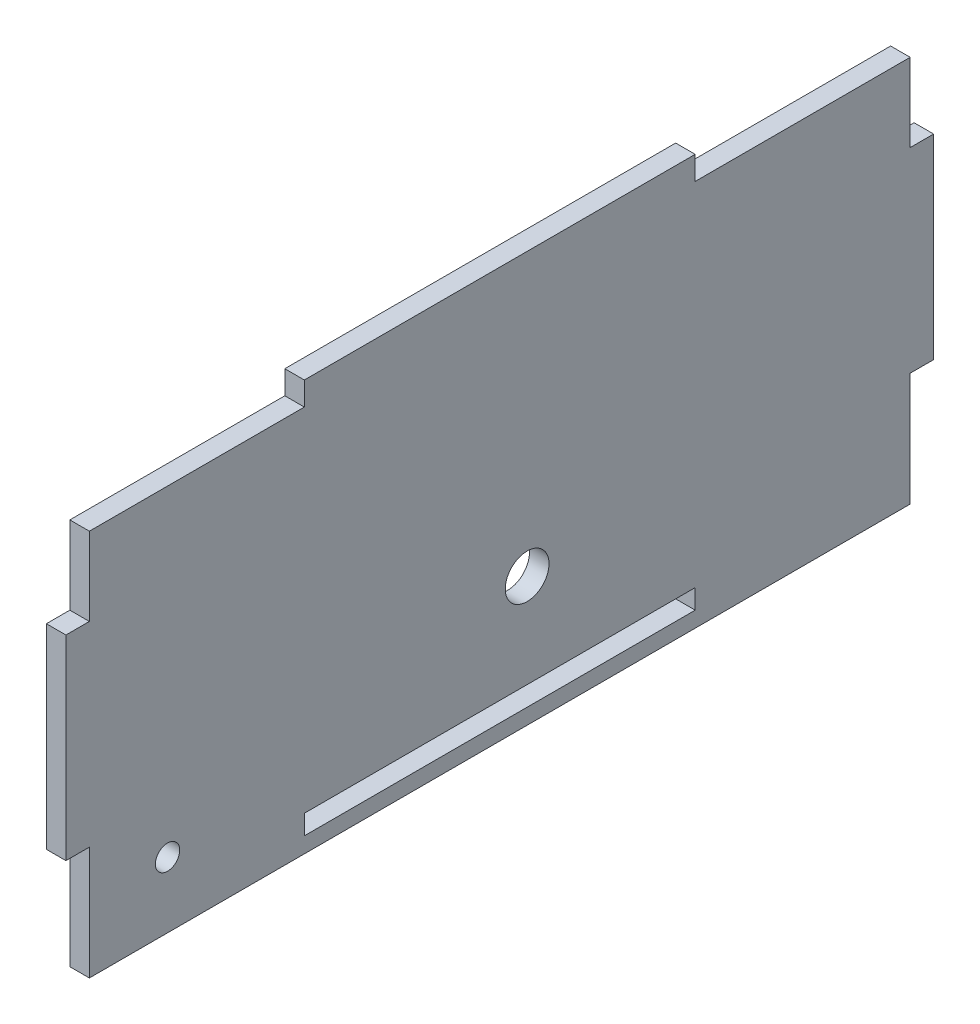
ISO-10303-21;
HEADER;
FILE_DESCRIPTION(('STEP AP214'),'2;1');
FILE_NAME('part.step','',(''),(''),'','','');
FILE_SCHEMA(('AUTOMOTIVE_DESIGN { 1 0 10303 214 1 1 1 1 }'));
ENDSEC;
DATA;
#1=APPLICATION_CONTEXT('core data for automotive mechanical design processes');
#2=APPLICATION_PROTOCOL_DEFINITION('international standard','automotive_design',2000,#1);
#3=PRODUCT_CONTEXT('',#1,'mechanical');
#4=PRODUCT('Part','Part','',(#3));
#5=PRODUCT_RELATED_PRODUCT_CATEGORY('part','',(#4));
#6=PRODUCT_DEFINITION_FORMATION('','',#4);
#7=PRODUCT_DEFINITION_CONTEXT('part definition',#1,'design');
#8=PRODUCT_DEFINITION('design','',#6,#7);
#9=PRODUCT_DEFINITION_SHAPE('','',#8);
#10=(LENGTH_UNIT() NAMED_UNIT(*) SI_UNIT(.MILLI.,.METRE.));
#11=(NAMED_UNIT(*) PLANE_ANGLE_UNIT() SI_UNIT($,.RADIAN.));
#12=(NAMED_UNIT(*) SI_UNIT($,.STERADIAN.) SOLID_ANGLE_UNIT());
#13=UNCERTAINTY_MEASURE_WITH_UNIT(LENGTH_MEASURE(1.E-05),#10,'distance_accuracy_value','');
#14=(GEOMETRIC_REPRESENTATION_CONTEXT(3) GLOBAL_UNCERTAINTY_ASSIGNED_CONTEXT((#13)) GLOBAL_UNIT_ASSIGNED_CONTEXT((#10,
#11,#12)) REPRESENTATION_CONTEXT('',''));
#15=CARTESIAN_POINT('',(0.,0.,0.));
#16=DIRECTION('',(0.,0.,1.));
#17=DIRECTION('',(1.,0.,0.));
#18=AXIS2_PLACEMENT_3D('',#15,#16,#17);
#19=CARTESIAN_POINT('',(3.175,0.,0.));
#20=DIRECTION('',(-1.,0.,0.));
#21=DIRECTION('',(0.,0.,1.));
#22=AXIS2_PLACEMENT_3D('',#19,#20,#21);
#23=PLANE('',#22);
#24=CARTESIAN_POINT('',(3.175,-23.6347,53.975));
#25=DIRECTION('',(1.,0.,0.));
#26=DIRECTION('',(0.,0.,-1.));
#27=AXIS2_PLACEMENT_3D('',#24,#25,#26);
#28=CIRCLE('',#27,1.9812);
#29=CARTESIAN_POINT('',(3.175,-23.6347,51.9938));
#30=VERTEX_POINT('',#29);
#31=EDGE_CURVE('E199',#30,#30,#28,.T.);
#32=ORIENTED_EDGE('',*,*,#31,.F.);
#33=EDGE_LOOP('',(#32));
#34=FACE_BOUND('',#33,.T.);
#35=DIRECTION('',(0.,-1.,0.));
#36=VECTOR('',#35,1.);
#37=CARTESIAN_POINT('',(3.175,28.575,66.675));
#38=LINE('',#37,#36);
#39=CARTESIAN_POINT('',(3.175,28.575,66.675));
#40=VERTEX_POINT('',#39);
#41=CARTESIAN_POINT('',(3.175,15.875,66.675));
#42=VERTEX_POINT('',#41);
#43=EDGE_CURVE('E209',#40,#42,#38,.T.);
#44=ORIENTED_EDGE('',*,*,#43,.T.);
#45=DIRECTION('',(0.,0.,1.));
#46=VECTOR('',#45,1.);
#47=CARTESIAN_POINT('',(3.175,15.875,66.675));
#48=LINE('',#47,#46);
#49=CARTESIAN_POINT('',(3.175,15.875,70.485));
#50=VERTEX_POINT('',#49);
#51=EDGE_CURVE('E212',#42,#50,#48,.T.);
#52=ORIENTED_EDGE('',*,*,#51,.T.);
#53=DIRECTION('',(0.,-1.,0.));
#54=VECTOR('',#53,1.);
#55=CARTESIAN_POINT('',(3.175,15.875,70.485));
#56=LINE('',#55,#54);
#57=CARTESIAN_POINT('',(3.175,-15.875,70.485));
#58=VERTEX_POINT('',#57);
#59=EDGE_CURVE('E215',#50,#58,#56,.T.);
#60=ORIENTED_EDGE('',*,*,#59,.T.);
#61=DIRECTION('',(0.,0.,-1.));
#62=VECTOR('',#61,1.);
#63=CARTESIAN_POINT('',(3.175,-15.875,66.675));
#64=LINE('',#63,#62);
#65=CARTESIAN_POINT('',(3.175,-15.875,66.675));
#66=VERTEX_POINT('',#65);
#67=EDGE_CURVE('E217',#58,#66,#64,.T.);
#68=ORIENTED_EDGE('',*,*,#67,.T.);
#69=DIRECTION('',(0.,-1.,0.));
#70=VECTOR('',#69,1.);
#71=CARTESIAN_POINT('',(3.175,-15.875,66.675));
#72=LINE('',#71,#70);
#73=CARTESIAN_POINT('',(3.175,-34.29,66.675));
#74=VERTEX_POINT('',#73);
#75=EDGE_CURVE('E219',#66,#74,#72,.T.);
#76=ORIENTED_EDGE('',*,*,#75,.T.);
#77=DIRECTION('',(0.,0.,-1.));
#78=VECTOR('',#77,1.);
#79=CARTESIAN_POINT('',(3.175,-34.29,66.675));
#80=LINE('',#79,#78);
#81=CARTESIAN_POINT('',(3.175,-34.29,-66.675));
#82=VERTEX_POINT('',#81);
#83=EDGE_CURVE('E221',#74,#82,#80,.T.);
#84=ORIENTED_EDGE('',*,*,#83,.T.);
#85=DIRECTION('',(0.,1.,0.));
#86=VECTOR('',#85,1.);
#87=CARTESIAN_POINT('',(3.175,-15.875,-66.675));
#88=LINE('',#87,#86);
#89=CARTESIAN_POINT('',(3.175,-15.875,-66.675));
#90=VERTEX_POINT('',#89);
#91=EDGE_CURVE('E223',#82,#90,#88,.T.);
#92=ORIENTED_EDGE('',*,*,#91,.T.);
#93=DIRECTION('',(0.,0.,-1.));
#94=VECTOR('',#93,1.);
#95=CARTESIAN_POINT('',(3.175,-15.875,-66.675));
#96=LINE('',#95,#94);
#97=CARTESIAN_POINT('',(3.175,-15.875,-70.485));
#98=VERTEX_POINT('',#97);
#99=EDGE_CURVE('E225',#90,#98,#96,.T.);
#100=ORIENTED_EDGE('',*,*,#99,.T.);
#101=DIRECTION('',(0.,1.,0.));
#102=VECTOR('',#101,1.);
#103=CARTESIAN_POINT('',(3.175,15.875,-70.485));
#104=LINE('',#103,#102);
#105=CARTESIAN_POINT('',(3.175,15.875,-70.485));
#106=VERTEX_POINT('',#105);
#107=EDGE_CURVE('E227',#98,#106,#104,.T.);
#108=ORIENTED_EDGE('',*,*,#107,.T.);
#109=DIRECTION('',(0.,0.,1.));
#110=VECTOR('',#109,1.);
#111=CARTESIAN_POINT('',(3.175,15.875,-66.675));
#112=LINE('',#111,#110);
#113=CARTESIAN_POINT('',(3.175,15.875,-66.675));
#114=VERTEX_POINT('',#113);
#115=EDGE_CURVE('E229',#106,#114,#112,.T.);
#116=ORIENTED_EDGE('',*,*,#115,.T.);
#117=DIRECTION('',(0.,1.,0.));
#118=VECTOR('',#117,1.);
#119=CARTESIAN_POINT('',(3.175,28.575,-66.675));
#120=LINE('',#119,#118);
#121=CARTESIAN_POINT('',(3.175,28.575,-66.675));
#122=VERTEX_POINT('',#121);
#123=EDGE_CURVE('E231',#114,#122,#120,.T.);
#124=ORIENTED_EDGE('',*,*,#123,.T.);
#125=DIRECTION('',(0.,0.,1.));
#126=VECTOR('',#125,1.);
#127=CARTESIAN_POINT('',(3.175,28.575,-31.75));
#128=LINE('',#127,#126);
#129=CARTESIAN_POINT('',(3.175,28.575,-31.75));
#130=VERTEX_POINT('',#129);
#131=EDGE_CURVE('E233',#122,#130,#128,.T.);
#132=ORIENTED_EDGE('',*,*,#131,.T.);
#133=DIRECTION('',(0.,1.,0.));
#134=VECTOR('',#133,1.);
#135=CARTESIAN_POINT('',(3.175,28.575,-31.75));
#136=LINE('',#135,#134);
#137=CARTESIAN_POINT('',(3.175,32.385,-31.75));
#138=VERTEX_POINT('',#137);
#139=EDGE_CURVE('E235',#130,#138,#136,.T.);
#140=ORIENTED_EDGE('',*,*,#139,.T.);
#141=DIRECTION('',(0.,0.,1.));
#142=VECTOR('',#141,1.);
#143=CARTESIAN_POINT('',(3.175,32.385,-31.75));
#144=LINE('',#143,#142);
#145=CARTESIAN_POINT('',(3.175,32.385,31.75));
#146=VERTEX_POINT('',#145);
#147=EDGE_CURVE('E237',#138,#146,#144,.T.);
#148=ORIENTED_EDGE('',*,*,#147,.T.);
#149=DIRECTION('',(0.,-1.,0.));
#150=VECTOR('',#149,1.);
#151=CARTESIAN_POINT('',(3.175,28.575,31.75));
#152=LINE('',#151,#150);
#153=CARTESIAN_POINT('',(3.175,28.575,31.75));
#154=VERTEX_POINT('',#153);
#155=EDGE_CURVE('E239',#146,#154,#152,.T.);
#156=ORIENTED_EDGE('',*,*,#155,.T.);
#157=DIRECTION('',(0.,0.,1.));
#158=VECTOR('',#157,1.);
#159=CARTESIAN_POINT('',(3.175,28.575,66.675));
#160=LINE('',#159,#158);
#161=EDGE_CURVE('E241',#154,#40,#160,.T.);
#162=ORIENTED_EDGE('',*,*,#161,.T.);
#163=EDGE_LOOP('',(#44,#52,#60,#68,#76,#84,#92,#100,#108,#116,#124,#132,#140,#148,#156,#162));
#164=FACE_BOUND('',#163,.T.);
#165=DIRECTION('',(0.,-1.,0.));
#166=VECTOR('',#165,1.);
#167=CARTESIAN_POINT('',(3.175,-28.575,31.75));
#168=LINE('',#167,#166);
#169=CARTESIAN_POINT('',(3.175,-28.575,31.75));
#170=VERTEX_POINT('',#169);
#171=CARTESIAN_POINT('',(3.175,-31.75,31.75));
#172=VERTEX_POINT('',#171);
#173=EDGE_CURVE('E170',#170,#172,#168,.T.);
#174=ORIENTED_EDGE('',*,*,#173,.F.);
#175=DIRECTION('',(0.,0.,1.));
#176=VECTOR('',#175,1.);
#177=CARTESIAN_POINT('',(3.175,-28.575,31.75));
#178=LINE('',#177,#176);
#179=CARTESIAN_POINT('',(3.175,-28.575,-31.75));
#180=VERTEX_POINT('',#179);
#181=EDGE_CURVE('E193',#180,#170,#178,.T.);
#182=ORIENTED_EDGE('',*,*,#181,.F.);
#183=DIRECTION('',(0.,1.,0.));
#184=VECTOR('',#183,1.);
#185=CARTESIAN_POINT('',(3.175,-28.575,-31.75));
#186=LINE('',#185,#184);
#187=CARTESIAN_POINT('',(3.175,-31.75,-31.75));
#188=VERTEX_POINT('',#187);
#189=EDGE_CURVE('E191',#188,#180,#186,.T.);
#190=ORIENTED_EDGE('',*,*,#189,.F.);
#191=DIRECTION('',(0.,0.,-1.));
#192=VECTOR('',#191,1.);
#193=CARTESIAN_POINT('',(3.175,-31.75,31.75));
#194=LINE('',#193,#192);
#195=EDGE_CURVE('E178',#172,#188,#194,.T.);
#196=ORIENTED_EDGE('',*,*,#195,.F.);
#197=EDGE_LOOP('',(#174,#182,#190,#196));
#198=FACE_BOUND('',#197,.T.);
#199=CARTESIAN_POINT('',(3.175,-13.335,-4.44499999999999));
#200=DIRECTION('',(1.,0.,0.));
#201=DIRECTION('',(0.,0.,-1.));
#202=AXIS2_PLACEMENT_3D('',#199,#200,#201);
#203=CIRCLE('',#202,3.556);
#204=CARTESIAN_POINT('',(3.175,-13.335,-8.00099999999999));
#205=VERTEX_POINT('',#204);
#206=EDGE_CURVE('E600',#205,#205,#203,.T.);
#207=ORIENTED_EDGE('',*,*,#206,.F.);
#208=EDGE_LOOP('',(#207));
#209=FACE_BOUND('',#208,.T.);
#210=ADVANCED_FACE('F33',(#34,#164,#198,#209),#23,.F.);
#211=CARTESIAN_POINT('',(0.,0.,0.));
#212=DIRECTION('',(-1.,0.,0.));
#213=DIRECTION('',(0.,0.,1.));
#214=AXIS2_PLACEMENT_3D('',#211,#212,#213);
#215=PLANE('',#214);
#216=CARTESIAN_POINT('',(0.,-23.6347,53.975));
#217=DIRECTION('',(1.,0.,0.));
#218=DIRECTION('',(0.,0.,-1.));
#219=AXIS2_PLACEMENT_3D('',#216,#217,#218);
#220=CIRCLE('',#219,1.9812);
#221=CARTESIAN_POINT('',(0.,-23.6347,51.9938));
#222=VERTEX_POINT('',#221);
#223=EDGE_CURVE('E606',#222,#222,#220,.T.);
#224=ORIENTED_EDGE('',*,*,#223,.T.);
#225=EDGE_LOOP('',(#224));
#226=FACE_BOUND('',#225,.T.);
#227=DIRECTION('',(0.,-1.,0.));
#228=VECTOR('',#227,1.);
#229=CARTESIAN_POINT('',(0.,28.575,66.675));
#230=LINE('',#229,#228);
#231=CARTESIAN_POINT('',(0.,28.575,66.675));
#232=VERTEX_POINT('',#231);
#233=CARTESIAN_POINT('',(0.,15.875,66.675));
#234=VERTEX_POINT('',#233);
#235=EDGE_CURVE('E186',#232,#234,#230,.T.);
#236=ORIENTED_EDGE('',*,*,#235,.F.);
#237=DIRECTION('',(0.,0.,1.));
#238=VECTOR('',#237,1.);
#239=CARTESIAN_POINT('',(0.,28.575,66.675));
#240=LINE('',#239,#238);
#241=CARTESIAN_POINT('',(0.,28.575,31.75));
#242=VERTEX_POINT('',#241);
#243=EDGE_CURVE('E213',#242,#232,#240,.T.);
#244=ORIENTED_EDGE('',*,*,#243,.F.);
#245=DIRECTION('',(0.,-1.,0.));
#246=VECTOR('',#245,1.);
#247=CARTESIAN_POINT('',(0.,28.575,31.75));
#248=LINE('',#247,#246);
#249=CARTESIAN_POINT('',(0.,32.385,31.75));
#250=VERTEX_POINT('',#249);
#251=EDGE_CURVE('E272',#250,#242,#248,.T.);
#252=ORIENTED_EDGE('',*,*,#251,.F.);
#253=DIRECTION('',(0.,0.,1.));
#254=VECTOR('',#253,1.);
#255=CARTESIAN_POINT('',(0.,32.385,-31.75));
#256=LINE('',#255,#254);
#257=CARTESIAN_POINT('',(0.,32.385,-31.75));
#258=VERTEX_POINT('',#257);
#259=EDGE_CURVE('E270',#258,#250,#256,.T.);
#260=ORIENTED_EDGE('',*,*,#259,.F.);
#261=DIRECTION('',(0.,1.,0.));
#262=VECTOR('',#261,1.);
#263=CARTESIAN_POINT('',(0.,28.575,-31.75));
#264=LINE('',#263,#262);
#265=CARTESIAN_POINT('',(0.,28.575,-31.75));
#266=VERTEX_POINT('',#265);
#267=EDGE_CURVE('E268',#266,#258,#264,.T.);
#268=ORIENTED_EDGE('',*,*,#267,.F.);
#269=DIRECTION('',(0.,0.,1.));
#270=VECTOR('',#269,1.);
#271=CARTESIAN_POINT('',(0.,28.575,-31.75));
#272=LINE('',#271,#270);
#273=CARTESIAN_POINT('',(0.,28.575,-66.675));
#274=VERTEX_POINT('',#273);
#275=EDGE_CURVE('E266',#274,#266,#272,.T.);
#276=ORIENTED_EDGE('',*,*,#275,.F.);
#277=DIRECTION('',(0.,1.,0.));
#278=VECTOR('',#277,1.);
#279=CARTESIAN_POINT('',(0.,28.575,-66.675));
#280=LINE('',#279,#278);
#281=CARTESIAN_POINT('',(0.,15.875,-66.675));
#282=VERTEX_POINT('',#281);
#283=EDGE_CURVE('E264',#282,#274,#280,.T.);
#284=ORIENTED_EDGE('',*,*,#283,.F.);
#285=DIRECTION('',(0.,0.,1.));
#286=VECTOR('',#285,1.);
#287=CARTESIAN_POINT('',(0.,15.875,-66.675));
#288=LINE('',#287,#286);
#289=CARTESIAN_POINT('',(0.,15.875,-70.485));
#290=VERTEX_POINT('',#289);
#291=EDGE_CURVE('E262',#290,#282,#288,.T.);
#292=ORIENTED_EDGE('',*,*,#291,.F.);
#293=DIRECTION('',(0.,1.,0.));
#294=VECTOR('',#293,1.);
#295=CARTESIAN_POINT('',(0.,15.875,-70.485));
#296=LINE('',#295,#294);
#297=CARTESIAN_POINT('',(0.,-15.875,-70.485));
#298=VERTEX_POINT('',#297);
#299=EDGE_CURVE('E260',#298,#290,#296,.T.);
#300=ORIENTED_EDGE('',*,*,#299,.F.);
#301=DIRECTION('',(0.,0.,-1.));
#302=VECTOR('',#301,1.);
#303=CARTESIAN_POINT('',(0.,-15.875,-66.675));
#304=LINE('',#303,#302);
#305=CARTESIAN_POINT('',(0.,-15.875,-66.675));
#306=VERTEX_POINT('',#305);
#307=EDGE_CURVE('E258',#306,#298,#304,.T.);
#308=ORIENTED_EDGE('',*,*,#307,.F.);
#309=DIRECTION('',(0.,1.,0.));
#310=VECTOR('',#309,1.);
#311=CARTESIAN_POINT('',(0.,-15.875,-66.675));
#312=LINE('',#311,#310);
#313=CARTESIAN_POINT('',(0.,-34.29,-66.675));
#314=VERTEX_POINT('',#313);
#315=EDGE_CURVE('E256',#314,#306,#312,.T.);
#316=ORIENTED_EDGE('',*,*,#315,.F.);
#317=DIRECTION('',(0.,0.,-1.));
#318=VECTOR('',#317,1.);
#319=CARTESIAN_POINT('',(0.,-34.29,66.675));
#320=LINE('',#319,#318);
#321=CARTESIAN_POINT('',(0.,-34.29,66.675));
#322=VERTEX_POINT('',#321);
#323=EDGE_CURVE('E254',#322,#314,#320,.T.);
#324=ORIENTED_EDGE('',*,*,#323,.F.);
#325=DIRECTION('',(0.,-1.,0.));
#326=VECTOR('',#325,1.);
#327=CARTESIAN_POINT('',(0.,-15.875,66.675));
#328=LINE('',#327,#326);
#329=CARTESIAN_POINT('',(0.,-15.875,66.675));
#330=VERTEX_POINT('',#329);
#331=EDGE_CURVE('E252',#330,#322,#328,.T.);
#332=ORIENTED_EDGE('',*,*,#331,.F.);
#333=DIRECTION('',(0.,0.,-1.));
#334=VECTOR('',#333,1.);
#335=CARTESIAN_POINT('',(0.,-15.875,66.675));
#336=LINE('',#335,#334);
#337=CARTESIAN_POINT('',(0.,-15.875,70.485));
#338=VERTEX_POINT('',#337);
#339=EDGE_CURVE('E250',#338,#330,#336,.T.);
#340=ORIENTED_EDGE('',*,*,#339,.F.);
#341=DIRECTION('',(0.,-1.,0.));
#342=VECTOR('',#341,1.);
#343=CARTESIAN_POINT('',(0.,15.875,70.485));
#344=LINE('',#343,#342);
#345=CARTESIAN_POINT('',(0.,15.875,70.485));
#346=VERTEX_POINT('',#345);
#347=EDGE_CURVE('E248',#346,#338,#344,.T.);
#348=ORIENTED_EDGE('',*,*,#347,.F.);
#349=DIRECTION('',(0.,0.,1.));
#350=VECTOR('',#349,1.);
#351=CARTESIAN_POINT('',(0.,15.875,66.675));
#352=LINE('',#351,#350);
#353=EDGE_CURVE('E246',#234,#346,#352,.T.);
#354=ORIENTED_EDGE('',*,*,#353,.F.);
#355=EDGE_LOOP('',(#236,#244,#252,#260,#268,#276,#284,#292,#300,#308,#316,#324,#332,#340,#348,#354));
#356=FACE_BOUND('',#355,.T.);
#357=DIRECTION('',(0.,0.,1.));
#358=VECTOR('',#357,1.);
#359=CARTESIAN_POINT('',(0.,-28.575,31.75));
#360=LINE('',#359,#358);
#361=CARTESIAN_POINT('',(0.,-28.575,-31.75));
#362=VERTEX_POINT('',#361);
#363=CARTESIAN_POINT('',(0.,-28.575,31.75));
#364=VERTEX_POINT('',#363);
#365=EDGE_CURVE('E179',#362,#364,#360,.T.);
#366=ORIENTED_EDGE('',*,*,#365,.T.);
#367=DIRECTION('',(0.,-1.,0.));
#368=VECTOR('',#367,1.);
#369=CARTESIAN_POINT('',(0.,-28.575,31.75));
#370=LINE('',#369,#368);
#371=CARTESIAN_POINT('',(0.,-31.75,31.75));
#372=VERTEX_POINT('',#371);
#373=EDGE_CURVE('E56',#364,#372,#370,.T.);
#374=ORIENTED_EDGE('',*,*,#373,.T.);
#375=DIRECTION('',(0.,0.,-1.));
#376=VECTOR('',#375,1.);
#377=CARTESIAN_POINT('',(0.,-31.75,31.75));
#378=LINE('',#377,#376);
#379=CARTESIAN_POINT('',(0.,-31.75,-31.75));
#380=VERTEX_POINT('',#379);
#381=EDGE_CURVE('E185',#372,#380,#378,.T.);
#382=ORIENTED_EDGE('',*,*,#381,.T.);
#383=DIRECTION('',(0.,1.,0.));
#384=VECTOR('',#383,1.);
#385=CARTESIAN_POINT('',(0.,-28.575,-31.75));
#386=LINE('',#385,#384);
#387=EDGE_CURVE('E201',#380,#362,#386,.T.);
#388=ORIENTED_EDGE('',*,*,#387,.T.);
#389=EDGE_LOOP('',(#366,#374,#382,#388));
#390=FACE_BOUND('',#389,.T.);
#391=CARTESIAN_POINT('',(0.,-13.335,-4.44499999999999));
#392=DIRECTION('',(1.,0.,0.));
#393=DIRECTION('',(0.,0.,-1.));
#394=AXIS2_PLACEMENT_3D('',#391,#392,#393);
#395=CIRCLE('',#394,3.556);
#396=CARTESIAN_POINT('',(0.,-13.335,-8.00099999999999));
#397=VERTEX_POINT('',#396);
#398=EDGE_CURVE('E603',#397,#397,#395,.T.);
#399=ORIENTED_EDGE('',*,*,#398,.T.);
#400=EDGE_LOOP('',(#399));
#401=FACE_BOUND('',#400,.T.);
#402=ADVANCED_FACE('F326',(#226,#356,#390,#401),#215,.T.);
#403=CARTESIAN_POINT('',(3.175,28.575,66.675));
#404=DIRECTION('',(0.,0.,-1.));
#405=DIRECTION('',(0.,1.,0.));
#406=AXIS2_PLACEMENT_3D('',#403,#404,#405);
#407=PLANE('',#406);
#408=ORIENTED_EDGE('',*,*,#235,.T.);
#409=DIRECTION('',(-1.,0.,0.));
#410=VECTOR('',#409,1.);
#411=CARTESIAN_POINT('',(3.175,15.875,66.675));
#412=LINE('',#411,#410);
#413=EDGE_CURVE('E11',#42,#234,#412,.T.);
#414=ORIENTED_EDGE('',*,*,#413,.F.);
#415=ORIENTED_EDGE('',*,*,#43,.F.);
#416=DIRECTION('',(-1.,0.,0.));
#417=VECTOR('',#416,1.);
#418=CARTESIAN_POINT('',(3.175,28.575,66.675));
#419=LINE('',#418,#417);
#420=EDGE_CURVE('E243',#40,#232,#419,.T.);
#421=ORIENTED_EDGE('',*,*,#420,.T.);
#422=EDGE_LOOP('',(#408,#414,#415,#421));
#423=FACE_BOUND('',#422,.T.);
#424=ADVANCED_FACE('F35',(#423),#407,.F.);
#425=CARTESIAN_POINT('',(3.175,15.875,66.675));
#426=DIRECTION('',(0.,-1.,0.));
#427=DIRECTION('',(0.,0.,-1.));
#428=AXIS2_PLACEMENT_3D('',#425,#426,#427);
#429=PLANE('',#428);
#430=ORIENTED_EDGE('',*,*,#353,.T.);
#431=DIRECTION('',(-1.,0.,0.));
#432=VECTOR('',#431,1.);
#433=CARTESIAN_POINT('',(3.175,15.875,70.485));
#434=LINE('',#433,#432);
#435=EDGE_CURVE('E41',#50,#346,#434,.T.);
#436=ORIENTED_EDGE('',*,*,#435,.F.);
#437=ORIENTED_EDGE('',*,*,#51,.F.);
#438=ORIENTED_EDGE('',*,*,#413,.T.);
#439=EDGE_LOOP('',(#430,#436,#437,#438));
#440=FACE_BOUND('',#439,.T.);
#441=ADVANCED_FACE('F343',(#440),#429,.F.);
#442=CARTESIAN_POINT('',(3.175,15.875,70.485));
#443=DIRECTION('',(0.,0.,-1.));
#444=DIRECTION('',(0.,1.,0.));
#445=AXIS2_PLACEMENT_3D('',#442,#443,#444);
#446=PLANE('',#445);
#447=ORIENTED_EDGE('',*,*,#347,.T.);
#448=DIRECTION('',(-1.,0.,0.));
#449=VECTOR('',#448,1.);
#450=CARTESIAN_POINT('',(3.175,-15.875,70.485));
#451=LINE('',#450,#449);
#452=EDGE_CURVE('E313',#58,#338,#451,.T.);
#453=ORIENTED_EDGE('',*,*,#452,.F.);
#454=ORIENTED_EDGE('',*,*,#59,.F.);
#455=ORIENTED_EDGE('',*,*,#435,.T.);
#456=EDGE_LOOP('',(#447,#453,#454,#455));
#457=FACE_BOUND('',#456,.T.);
#458=ADVANCED_FACE('F320',(#457),#446,.F.);
#459=CARTESIAN_POINT('',(3.175,-15.875,66.675));
#460=DIRECTION('',(0.,1.,0.));
#461=DIRECTION('',(0.,0.,1.));
#462=AXIS2_PLACEMENT_3D('',#459,#460,#461);
#463=PLANE('',#462);
#464=ORIENTED_EDGE('',*,*,#339,.T.);
#465=DIRECTION('',(-1.,0.,0.));
#466=VECTOR('',#465,1.);
#467=CARTESIAN_POINT('',(3.175,-15.875,66.675));
#468=LINE('',#467,#466);
#469=EDGE_CURVE('E310',#66,#330,#468,.T.);
#470=ORIENTED_EDGE('',*,*,#469,.F.);
#471=ORIENTED_EDGE('',*,*,#67,.F.);
#472=ORIENTED_EDGE('',*,*,#452,.T.);
#473=EDGE_LOOP('',(#464,#470,#471,#472));
#474=FACE_BOUND('',#473,.T.);
#475=ADVANCED_FACE('F332',(#474),#463,.F.);
#476=CARTESIAN_POINT('',(3.175,-15.875,66.675));
#477=DIRECTION('',(0.,0.,-1.));
#478=DIRECTION('',(-1.,0.,0.));
#479=AXIS2_PLACEMENT_3D('',#476,#477,#478);
#480=PLANE('',#479);
#481=ORIENTED_EDGE('',*,*,#331,.T.);
#482=DIRECTION('',(-1.,0.,0.));
#483=VECTOR('',#482,1.);
#484=CARTESIAN_POINT('',(3.175,-34.29,66.675));
#485=LINE('',#484,#483);
#486=EDGE_CURVE('E307',#74,#322,#485,.T.);
#487=ORIENTED_EDGE('',*,*,#486,.F.);
#488=ORIENTED_EDGE('',*,*,#75,.F.);
#489=ORIENTED_EDGE('',*,*,#469,.T.);
#490=EDGE_LOOP('',(#481,#487,#488,#489));
#491=FACE_BOUND('',#490,.T.);
#492=ADVANCED_FACE('F336',(#491),#480,.F.);
#493=CARTESIAN_POINT('',(3.175,-34.29,66.675));
#494=DIRECTION('',(0.,1.,0.));
#495=DIRECTION('',(0.,0.,1.));
#496=AXIS2_PLACEMENT_3D('',#493,#494,#495);
#497=PLANE('',#496);
#498=ORIENTED_EDGE('',*,*,#323,.T.);
#499=DIRECTION('',(-1.,0.,0.));
#500=VECTOR('',#499,1.);
#501=CARTESIAN_POINT('',(3.175,-34.29,-66.675));
#502=LINE('',#501,#500);
#503=EDGE_CURVE('E304',#82,#314,#502,.T.);
#504=ORIENTED_EDGE('',*,*,#503,.F.);
#505=ORIENTED_EDGE('',*,*,#83,.F.);
#506=ORIENTED_EDGE('',*,*,#486,.T.);
#507=EDGE_LOOP('',(#498,#504,#505,#506));
#508=FACE_BOUND('',#507,.T.);
#509=ADVANCED_FACE('F396',(#508),#497,.F.);
#510=CARTESIAN_POINT('',(3.175,-15.875,-66.675));
#511=DIRECTION('',(0.,0.,1.));
#512=DIRECTION('',(1.,0.,0.));
#513=AXIS2_PLACEMENT_3D('',#510,#511,#512);
#514=PLANE('',#513);
#515=ORIENTED_EDGE('',*,*,#315,.T.);
#516=DIRECTION('',(-1.,0.,0.));
#517=VECTOR('',#516,1.);
#518=CARTESIAN_POINT('',(3.175,-15.875,-66.675));
#519=LINE('',#518,#517);
#520=EDGE_CURVE('E301',#90,#306,#519,.T.);
#521=ORIENTED_EDGE('',*,*,#520,.F.);
#522=ORIENTED_EDGE('',*,*,#91,.F.);
#523=ORIENTED_EDGE('',*,*,#503,.T.);
#524=EDGE_LOOP('',(#515,#521,#522,#523));
#525=FACE_BOUND('',#524,.T.);
#526=ADVANCED_FACE('F393',(#525),#514,.F.);
#527=CARTESIAN_POINT('',(3.175,-15.875,-66.675));
#528=DIRECTION('',(0.,1.,0.));
#529=DIRECTION('',(0.,0.,1.));
#530=AXIS2_PLACEMENT_3D('',#527,#528,#529);
#531=PLANE('',#530);
#532=ORIENTED_EDGE('',*,*,#307,.T.);
#533=DIRECTION('',(-1.,0.,0.));
#534=VECTOR('',#533,1.);
#535=CARTESIAN_POINT('',(3.175,-15.875,-70.485));
#536=LINE('',#535,#534);
#537=EDGE_CURVE('E298',#98,#298,#536,.T.);
#538=ORIENTED_EDGE('',*,*,#537,.F.);
#539=ORIENTED_EDGE('',*,*,#99,.F.);
#540=ORIENTED_EDGE('',*,*,#520,.T.);
#541=EDGE_LOOP('',(#532,#538,#539,#540));
#542=FACE_BOUND('',#541,.T.);
#543=ADVANCED_FACE('F389',(#542),#531,.F.);
#544=CARTESIAN_POINT('',(3.175,15.875,-70.485));
#545=DIRECTION('',(0.,0.,1.));
#546=DIRECTION('',(1.,0.,0.));
#547=AXIS2_PLACEMENT_3D('',#544,#545,#546);
#548=PLANE('',#547);
#549=ORIENTED_EDGE('',*,*,#299,.T.);
#550=DIRECTION('',(-1.,0.,0.));
#551=VECTOR('',#550,1.);
#552=CARTESIAN_POINT('',(3.175,15.875,-70.485));
#553=LINE('',#552,#551);
#554=EDGE_CURVE('E295',#106,#290,#553,.T.);
#555=ORIENTED_EDGE('',*,*,#554,.F.);
#556=ORIENTED_EDGE('',*,*,#107,.F.);
#557=ORIENTED_EDGE('',*,*,#537,.T.);
#558=EDGE_LOOP('',(#549,#555,#556,#557));
#559=FACE_BOUND('',#558,.T.);
#560=ADVANCED_FACE('F385',(#559),#548,.F.);
#561=CARTESIAN_POINT('',(3.175,15.875,-66.675));
#562=DIRECTION('',(0.,-1.,0.));
#563=DIRECTION('',(0.,0.,-1.));
#564=AXIS2_PLACEMENT_3D('',#561,#562,#563);
#565=PLANE('',#564);
#566=ORIENTED_EDGE('',*,*,#291,.T.);
#567=DIRECTION('',(-1.,0.,0.));
#568=VECTOR('',#567,1.);
#569=CARTESIAN_POINT('',(3.175,15.875,-66.675));
#570=LINE('',#569,#568);
#571=EDGE_CURVE('E292',#114,#282,#570,.T.);
#572=ORIENTED_EDGE('',*,*,#571,.F.);
#573=ORIENTED_EDGE('',*,*,#115,.F.);
#574=ORIENTED_EDGE('',*,*,#554,.T.);
#575=EDGE_LOOP('',(#566,#572,#573,#574));
#576=FACE_BOUND('',#575,.T.);
#577=ADVANCED_FACE('F380',(#576),#565,.F.);
#578=CARTESIAN_POINT('',(3.175,28.575,-66.675));
#579=DIRECTION('',(0.,0.,1.));
#580=DIRECTION('',(1.,0.,0.));
#581=AXIS2_PLACEMENT_3D('',#578,#579,#580);
#582=PLANE('',#581);
#583=ORIENTED_EDGE('',*,*,#283,.T.);
#584=DIRECTION('',(-1.,0.,0.));
#585=VECTOR('',#584,1.);
#586=CARTESIAN_POINT('',(3.175,28.575,-66.675));
#587=LINE('',#586,#585);
#588=EDGE_CURVE('E289',#122,#274,#587,.T.);
#589=ORIENTED_EDGE('',*,*,#588,.F.);
#590=ORIENTED_EDGE('',*,*,#123,.F.);
#591=ORIENTED_EDGE('',*,*,#571,.T.);
#592=EDGE_LOOP('',(#583,#589,#590,#591));
#593=FACE_BOUND('',#592,.T.);
#594=ADVANCED_FACE('F374',(#593),#582,.F.);
#595=CARTESIAN_POINT('',(3.175,28.575,-31.75));
#596=DIRECTION('',(0.,-1.,0.));
#597=DIRECTION('',(0.,0.,-1.));
#598=AXIS2_PLACEMENT_3D('',#595,#596,#597);
#599=PLANE('',#598);
#600=ORIENTED_EDGE('',*,*,#275,.T.);
#601=DIRECTION('',(-1.,0.,0.));
#602=VECTOR('',#601,1.);
#603=CARTESIAN_POINT('',(3.175,28.575,-31.75));
#604=LINE('',#603,#602);
#605=EDGE_CURVE('E286',#130,#266,#604,.T.);
#606=ORIENTED_EDGE('',*,*,#605,.F.);
#607=ORIENTED_EDGE('',*,*,#131,.F.);
#608=ORIENTED_EDGE('',*,*,#588,.T.);
#609=EDGE_LOOP('',(#600,#606,#607,#608));
#610=FACE_BOUND('',#609,.T.);
#611=ADVANCED_FACE('F370',(#610),#599,.F.);
#612=CARTESIAN_POINT('',(3.175,28.575,-31.75));
#613=DIRECTION('',(0.,0.,1.));
#614=DIRECTION('',(0.,-1.,0.));
#615=AXIS2_PLACEMENT_3D('',#612,#613,#614);
#616=PLANE('',#615);
#617=ORIENTED_EDGE('',*,*,#267,.T.);
#618=DIRECTION('',(-1.,0.,0.));
#619=VECTOR('',#618,1.);
#620=CARTESIAN_POINT('',(3.175,32.385,-31.75));
#621=LINE('',#620,#619);
#622=EDGE_CURVE('E283',#138,#258,#621,.T.);
#623=ORIENTED_EDGE('',*,*,#622,.F.);
#624=ORIENTED_EDGE('',*,*,#139,.F.);
#625=ORIENTED_EDGE('',*,*,#605,.T.);
#626=EDGE_LOOP('',(#617,#623,#624,#625));
#627=FACE_BOUND('',#626,.T.);
#628=ADVANCED_FACE('F365',(#627),#616,.F.);
#629=CARTESIAN_POINT('',(3.175,32.385,-31.75));
#630=DIRECTION('',(0.,-1.,0.));
#631=DIRECTION('',(0.,0.,-1.));
#632=AXIS2_PLACEMENT_3D('',#629,#630,#631);
#633=PLANE('',#632);
#634=ORIENTED_EDGE('',*,*,#259,.T.);
#635=DIRECTION('',(-1.,0.,0.));
#636=VECTOR('',#635,1.);
#637=CARTESIAN_POINT('',(3.175,32.385,31.75));
#638=LINE('',#637,#636);
#639=EDGE_CURVE('E280',#146,#250,#638,.T.);
#640=ORIENTED_EDGE('',*,*,#639,.F.);
#641=ORIENTED_EDGE('',*,*,#147,.F.);
#642=ORIENTED_EDGE('',*,*,#622,.T.);
#643=EDGE_LOOP('',(#634,#640,#641,#642));
#644=FACE_BOUND('',#643,.T.);
#645=ADVANCED_FACE('F359',(#644),#633,.F.);
#646=CARTESIAN_POINT('',(3.175,28.575,31.75));
#647=DIRECTION('',(0.,0.,-1.));
#648=DIRECTION('',(-1.,0.,0.));
#649=AXIS2_PLACEMENT_3D('',#646,#647,#648);
#650=PLANE('',#649);
#651=ORIENTED_EDGE('',*,*,#251,.T.);
#652=DIRECTION('',(-1.,0.,0.));
#653=VECTOR('',#652,1.);
#654=CARTESIAN_POINT('',(3.175,28.575,31.75));
#655=LINE('',#654,#653);
#656=EDGE_CURVE('E277',#154,#242,#655,.T.);
#657=ORIENTED_EDGE('',*,*,#656,.F.);
#658=ORIENTED_EDGE('',*,*,#155,.F.);
#659=ORIENTED_EDGE('',*,*,#639,.T.);
#660=EDGE_LOOP('',(#651,#657,#658,#659));
#661=FACE_BOUND('',#660,.T.);
#662=ADVANCED_FACE('F355',(#661),#650,.F.);
#663=CARTESIAN_POINT('',(3.175,28.575,66.675));
#664=DIRECTION('',(0.,-1.,0.));
#665=DIRECTION('',(0.,0.,-1.));
#666=AXIS2_PLACEMENT_3D('',#663,#664,#665);
#667=PLANE('',#666);
#668=ORIENTED_EDGE('',*,*,#243,.T.);
#669=ORIENTED_EDGE('',*,*,#420,.F.);
#670=ORIENTED_EDGE('',*,*,#161,.F.);
#671=ORIENTED_EDGE('',*,*,#656,.T.);
#672=EDGE_LOOP('',(#668,#669,#670,#671));
#673=FACE_BOUND('',#672,.T.);
#674=ADVANCED_FACE('F350',(#673),#667,.F.);
#675=CARTESIAN_POINT('',(3.175,-28.575,31.75));
#676=DIRECTION('',(0.,0.,-1.));
#677=DIRECTION('',(0.,1.,0.));
#678=AXIS2_PLACEMENT_3D('',#675,#676,#677);
#679=PLANE('',#678);
#680=ORIENTED_EDGE('',*,*,#373,.F.);
#681=DIRECTION('',(-1.,0.,0.));
#682=VECTOR('',#681,1.);
#683=CARTESIAN_POINT('',(3.175,-28.575,31.75));
#684=LINE('',#683,#682);
#685=EDGE_CURVE('E174',#170,#364,#684,.T.);
#686=ORIENTED_EDGE('',*,*,#685,.F.);
#687=ORIENTED_EDGE('',*,*,#173,.T.);
#688=DIRECTION('',(-1.,0.,0.));
#689=VECTOR('',#688,1.);
#690=CARTESIAN_POINT('',(3.175,-31.75,31.75));
#691=LINE('',#690,#689);
#692=EDGE_CURVE('E173',#172,#372,#691,.T.);
#693=ORIENTED_EDGE('',*,*,#692,.T.);
#694=EDGE_LOOP('',(#680,#686,#687,#693));
#695=FACE_BOUND('',#694,.T.);
#696=ADVANCED_FACE('F172',(#695),#679,.T.);
#697=CARTESIAN_POINT('',(3.175,-31.75,31.75));
#698=DIRECTION('',(0.,1.,0.));
#699=DIRECTION('',(0.,0.,1.));
#700=AXIS2_PLACEMENT_3D('',#697,#698,#699);
#701=PLANE('',#700);
#702=ORIENTED_EDGE('',*,*,#381,.F.);
#703=ORIENTED_EDGE('',*,*,#692,.F.);
#704=ORIENTED_EDGE('',*,*,#195,.T.);
#705=DIRECTION('',(-1.,0.,0.));
#706=VECTOR('',#705,1.);
#707=CARTESIAN_POINT('',(3.175,-31.75,-31.75));
#708=LINE('',#707,#706);
#709=EDGE_CURVE('E187',#188,#380,#708,.T.);
#710=ORIENTED_EDGE('',*,*,#709,.T.);
#711=EDGE_LOOP('',(#702,#703,#704,#710));
#712=FACE_BOUND('',#711,.T.);
#713=ADVANCED_FACE('F182',(#712),#701,.T.);
#714=CARTESIAN_POINT('',(3.175,-28.575,-31.75));
#715=DIRECTION('',(0.,0.,1.));
#716=DIRECTION('',(0.,-1.,0.));
#717=AXIS2_PLACEMENT_3D('',#714,#715,#716);
#718=PLANE('',#717);
#719=ORIENTED_EDGE('',*,*,#387,.F.);
#720=ORIENTED_EDGE('',*,*,#709,.F.);
#721=ORIENTED_EDGE('',*,*,#189,.T.);
#722=DIRECTION('',(-1.,0.,0.));
#723=VECTOR('',#722,1.);
#724=CARTESIAN_POINT('',(3.175,-28.575,-31.75));
#725=LINE('',#724,#723);
#726=EDGE_CURVE('E48',#180,#362,#725,.T.);
#727=ORIENTED_EDGE('',*,*,#726,.T.);
#728=EDGE_LOOP('',(#719,#720,#721,#727));
#729=FACE_BOUND('',#728,.T.);
#730=ADVANCED_FACE('F481',(#729),#718,.T.);
#731=CARTESIAN_POINT('',(3.175,-28.575,31.75));
#732=DIRECTION('',(0.,-1.,0.));
#733=DIRECTION('',(0.,0.,-1.));
#734=AXIS2_PLACEMENT_3D('',#731,#732,#733);
#735=PLANE('',#734);
#736=ORIENTED_EDGE('',*,*,#365,.F.);
#737=ORIENTED_EDGE('',*,*,#726,.F.);
#738=ORIENTED_EDGE('',*,*,#181,.T.);
#739=ORIENTED_EDGE('',*,*,#685,.T.);
#740=EDGE_LOOP('',(#736,#737,#738,#739));
#741=FACE_BOUND('',#740,.T.);
#742=ADVANCED_FACE('F487',(#741),#735,.T.);
#743=CARTESIAN_POINT('',(3.175,-23.6347,53.975));
#744=DIRECTION('',(-1.,0.,0.));
#745=DIRECTION('',(0.,0.,1.));
#746=AXIS2_PLACEMENT_3D('',#743,#744,#745);
#747=CYLINDRICAL_SURFACE('',#746,1.9812);
#748=ORIENTED_EDGE('',*,*,#31,.T.);
#749=EDGE_LOOP('',(#748));
#750=FACE_BOUND('',#749,.T.);
#751=ORIENTED_EDGE('',*,*,#223,.F.);
#752=EDGE_LOOP('',(#751));
#753=FACE_BOUND('',#752,.T.);
#754=ADVANCED_FACE('F495',(#750,#753),#747,.F.);
#755=CARTESIAN_POINT('',(3.175,-13.335,-4.44499999999999));
#756=DIRECTION('',(-1.,0.,0.));
#757=DIRECTION('',(0.,0.,1.));
#758=AXIS2_PLACEMENT_3D('',#755,#756,#757);
#759=CYLINDRICAL_SURFACE('',#758,3.556);
#760=ORIENTED_EDGE('',*,*,#206,.T.);
#761=EDGE_LOOP('',(#760));
#762=FACE_BOUND('',#761,.T.);
#763=ORIENTED_EDGE('',*,*,#398,.F.);
#764=EDGE_LOOP('',(#763));
#765=FACE_BOUND('',#764,.T.);
#766=ADVANCED_FACE('F502',(#762,#765),#759,.F.);
#767=CLOSED_SHELL('',(#210,#402,#424,#441,#458,#475,#492,#509,#526,#543,#560,#577,#594,#611,
#628,#645,#662,#674,#696,#713,#730,#742,#754,#766));
#768=MANIFOLD_SOLID_BREP('B2',#767);
#769=ADVANCED_BREP_SHAPE_REPRESENTATION('',(#18,#768),#14);
#770=SHAPE_DEFINITION_REPRESENTATION(#9,#769);
ENDSEC;
END-ISO-10303-21;
